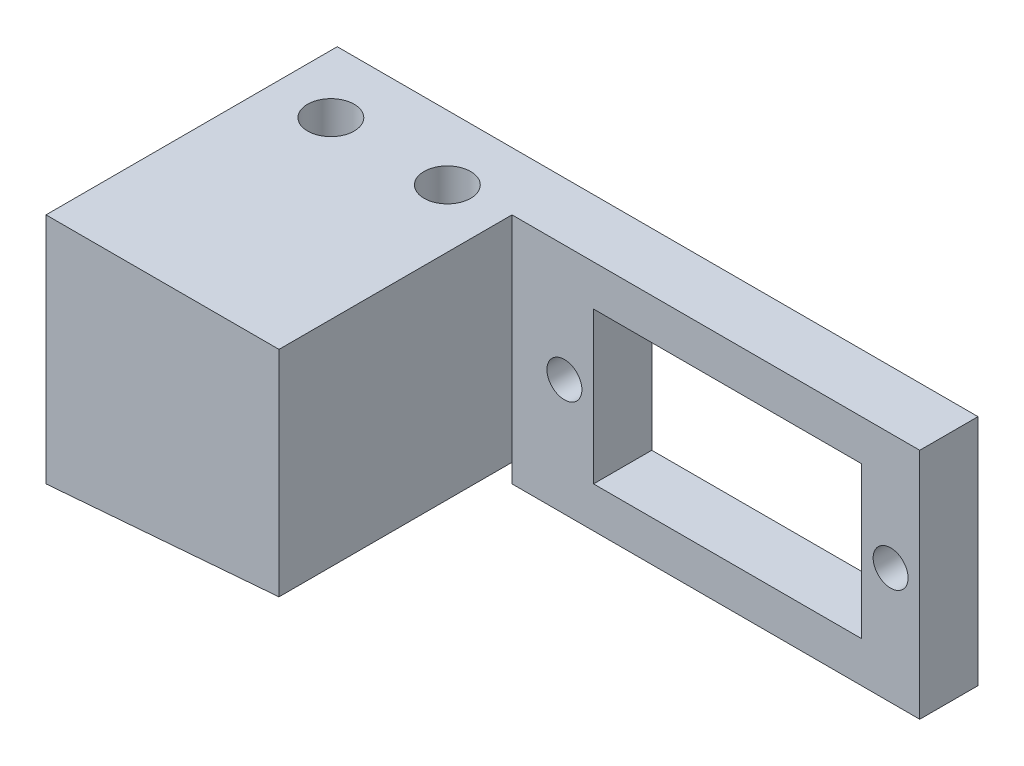
ISO-10303-21;
HEADER;
FILE_DESCRIPTION(('STEP AP214'),'2;1');
FILE_NAME('part.step','',(''),(''),'','','');
FILE_SCHEMA(('AUTOMOTIVE_DESIGN { 1 0 10303 214 1 1 1 1 }'));
ENDSEC;
DATA;
#1=APPLICATION_CONTEXT('core data for automotive mechanical design processes');
#2=APPLICATION_PROTOCOL_DEFINITION('international standard','automotive_design',2000,#1);
#3=PRODUCT_CONTEXT('',#1,'mechanical');
#4=PRODUCT('Part','Part','',(#3));
#5=PRODUCT_RELATED_PRODUCT_CATEGORY('part','',(#4));
#6=PRODUCT_DEFINITION_FORMATION('','',#4);
#7=PRODUCT_DEFINITION_CONTEXT('part definition',#1,'design');
#8=PRODUCT_DEFINITION('design','',#6,#7);
#9=PRODUCT_DEFINITION_SHAPE('','',#8);
#10=(LENGTH_UNIT() NAMED_UNIT(*) SI_UNIT(.MILLI.,.METRE.));
#11=(NAMED_UNIT(*) PLANE_ANGLE_UNIT() SI_UNIT($,.RADIAN.));
#12=(NAMED_UNIT(*) SI_UNIT($,.STERADIAN.) SOLID_ANGLE_UNIT());
#13=UNCERTAINTY_MEASURE_WITH_UNIT(LENGTH_MEASURE(1.E-05),#10,'distance_accuracy_value','');
#14=(GEOMETRIC_REPRESENTATION_CONTEXT(3) GLOBAL_UNCERTAINTY_ASSIGNED_CONTEXT((#13)) GLOBAL_UNIT_ASSIGNED_CONTEXT((#10,
#11,#12)) REPRESENTATION_CONTEXT('',''));
#15=CARTESIAN_POINT('',(0.,0.,0.));
#16=DIRECTION('',(0.,0.,1.));
#17=DIRECTION('',(1.,0.,0.));
#18=AXIS2_PLACEMENT_3D('',#15,#16,#17);
#19=CARTESIAN_POINT('',(0.,0.,5.));
#20=DIRECTION('',(0.,0.,1.));
#21=DIRECTION('',(1.,0.,0.));
#22=AXIS2_PLACEMENT_3D('',#19,#20,#21);
#23=PLANE('',#22);
#24=DIRECTION('',(0.,1.,0.));
#25=VECTOR('',#24,1.);
#26=CARTESIAN_POINT('',(-8.33333333333336,-10.0666666666667,5.));
#27=LINE('',#26,#25);
#28=CARTESIAN_POINT('',(-8.33333333333336,-11.6666666666667,5.));
#29=VERTEX_POINT('',#28);
#30=CARTESIAN_POINT('',(-8.33333333333336,-10.0666666666667,5.));
#31=VERTEX_POINT('',#30);
#32=EDGE_CURVE('E128',#29,#31,#27,.T.);
#33=ORIENTED_EDGE('',*,*,#32,.F.);
#34=DIRECTION('',(1.,0.,0.));
#35=VECTOR('',#34,1.);
#36=CARTESIAN_POINT('',(-28.3333333333334,-11.6666666666667,5.));
#37=LINE('',#36,#35);
#38=CARTESIAN_POINT('',(26.6666666666666,-11.6666666666667,5.));
#39=VERTEX_POINT('',#38);
#40=EDGE_CURVE('E135',#29,#39,#37,.T.);
#41=ORIENTED_EDGE('',*,*,#40,.T.);
#42=DIRECTION('',(0.,1.,0.));
#43=VECTOR('',#42,1.);
#44=CARTESIAN_POINT('',(26.6666666666666,8.33333333333334,5.));
#45=LINE('',#44,#43);
#46=CARTESIAN_POINT('',(26.6666666666666,8.33333333333334,5.));
#47=VERTEX_POINT('',#46);
#48=EDGE_CURVE('E144',#39,#47,#45,.T.);
#49=ORIENTED_EDGE('',*,*,#48,.T.);
#50=DIRECTION('',(-1.,0.,0.));
#51=VECTOR('',#50,1.);
#52=CARTESIAN_POINT('',(-28.3333333333334,8.33333333333334,5.));
#53=LINE('',#52,#51);
#54=CARTESIAN_POINT('',(-8.33333333333336,8.33333333333334,5.));
#55=VERTEX_POINT('',#54);
#56=EDGE_CURVE('E51',#47,#55,#53,.T.);
#57=ORIENTED_EDGE('',*,*,#56,.T.);
#58=DIRECTION('',(0.,1.,0.));
#59=VECTOR('',#58,1.);
#60=CARTESIAN_POINT('',(-8.33333333333336,0.,5.));
#61=LINE('',#60,#59);
#62=EDGE_CURVE('E137',#31,#55,#61,.T.);
#63=ORIENTED_EDGE('',*,*,#62,.F.);
#64=EDGE_LOOP('',(#33,#41,#49,#57,#63));
#65=FACE_BOUND('',#64,.T.);
#66=CARTESIAN_POINT('',(-3.83333333333336,-1.66666666666666,5.));
#67=DIRECTION('',(0.,0.,1.));
#68=DIRECTION('',(1.,0.,0.));
#69=AXIS2_PLACEMENT_3D('',#66,#67,#68);
#70=CIRCLE('',#69,1.5);
#71=CARTESIAN_POINT('',(-2.33333333333336,-1.66666666666666,5.));
#72=VERTEX_POINT('',#71);
#73=EDGE_CURVE('E234',#72,#72,#70,.T.);
#74=ORIENTED_EDGE('',*,*,#73,.F.);
#75=EDGE_LOOP('',(#74));
#76=FACE_BOUND('',#75,.T.);
#77=CARTESIAN_POINT('',(24.1666666666666,-1.66666666666666,5.));
#78=DIRECTION('',(0.,0.,1.));
#79=DIRECTION('',(1.,0.,0.));
#80=AXIS2_PLACEMENT_3D('',#77,#78,#79);
#81=CIRCLE('',#80,1.5);
#82=CARTESIAN_POINT('',(25.6666666666666,-1.66666666666666,5.));
#83=VERTEX_POINT('',#82);
#84=EDGE_CURVE('E235',#83,#83,#81,.T.);
#85=ORIENTED_EDGE('',*,*,#84,.F.);
#86=EDGE_LOOP('',(#85));
#87=FACE_BOUND('',#86,.T.);
#88=DIRECTION('',(0.,1.,0.));
#89=VECTOR('',#88,1.);
#90=CARTESIAN_POINT('',(21.6666666666666,4.83333333333334,5.));
#91=LINE('',#90,#89);
#92=CARTESIAN_POINT('',(21.6666666666666,-8.16666666666666,5.));
#93=VERTEX_POINT('',#92);
#94=CARTESIAN_POINT('',(21.6666666666666,4.83333333333334,5.));
#95=VERTEX_POINT('',#94);
#96=EDGE_CURVE('E59',#93,#95,#91,.T.);
#97=ORIENTED_EDGE('',*,*,#96,.F.);
#98=DIRECTION('',(1.,0.,0.));
#99=VECTOR('',#98,1.);
#100=CARTESIAN_POINT('',(21.6666666666666,-8.16666666666666,5.));
#101=LINE('',#100,#99);
#102=CARTESIAN_POINT('',(-1.33333333333336,-8.16666666666666,5.));
#103=VERTEX_POINT('',#102);
#104=EDGE_CURVE('E247',#103,#93,#101,.T.);
#105=ORIENTED_EDGE('',*,*,#104,.F.);
#106=DIRECTION('',(0.,-1.,0.));
#107=VECTOR('',#106,1.);
#108=CARTESIAN_POINT('',(-1.33333333333336,4.83333333333334,5.));
#109=LINE('',#108,#107);
#110=CARTESIAN_POINT('',(-1.33333333333336,4.83333333333334,5.));
#111=VERTEX_POINT('',#110);
#112=EDGE_CURVE('E244',#111,#103,#109,.T.);
#113=ORIENTED_EDGE('',*,*,#112,.F.);
#114=DIRECTION('',(-1.,0.,0.));
#115=VECTOR('',#114,1.);
#116=CARTESIAN_POINT('',(21.6666666666666,4.83333333333334,5.));
#117=LINE('',#116,#115);
#118=EDGE_CURVE('E241',#95,#111,#117,.T.);
#119=ORIENTED_EDGE('',*,*,#118,.F.);
#120=EDGE_LOOP('',(#97,#105,#113,#119));
#121=FACE_BOUND('',#120,.T.);
#122=ADVANCED_FACE('F36',(#65,#76,#87,#121),#23,.T.);
#123=CARTESIAN_POINT('',(-28.3333333333334,8.33333333333334,5.));
#124=DIRECTION('',(1.,0.,0.));
#125=DIRECTION('',(0.,0.,-1.));
#126=AXIS2_PLACEMENT_3D('',#123,#124,#125);
#127=PLANE('',#126);
#128=DIRECTION('',(0.,-1.,0.));
#129=VECTOR('',#128,1.);
#130=CARTESIAN_POINT('',(-28.3333333333334,8.33333333333334,0.));
#131=LINE('',#130,#129);
#132=CARTESIAN_POINT('',(-28.3333333333334,8.33333333333334,0.));
#133=VERTEX_POINT('',#132);
#134=CARTESIAN_POINT('',(-28.3333333333334,-11.6666666666667,0.));
#135=VERTEX_POINT('',#134);
#136=EDGE_CURVE('E156',#133,#135,#131,.T.);
#137=ORIENTED_EDGE('',*,*,#136,.T.);
#138=DIRECTION('',(0.,0.,-1.));
#139=VECTOR('',#138,1.);
#140=CARTESIAN_POINT('',(-28.3333333333334,-11.6666666666667,5.));
#141=LINE('',#140,#139);
#142=CARTESIAN_POINT('',(-28.3333333333334,-11.6666666666667,25.));
#143=VERTEX_POINT('',#142);
#144=EDGE_CURVE('E169',#143,#135,#141,.T.);
#145=ORIENTED_EDGE('',*,*,#144,.F.);
#146=DIRECTION('',(0.,1.,0.));
#147=VECTOR('',#146,1.);
#148=CARTESIAN_POINT('',(-28.3333333333334,-11.6666666666667,25.));
#149=LINE('',#148,#147);
#150=CARTESIAN_POINT('',(-28.3333333333334,8.33333333333334,25.));
#151=VERTEX_POINT('',#150);
#152=EDGE_CURVE('E214',#143,#151,#149,.T.);
#153=ORIENTED_EDGE('',*,*,#152,.T.);
#154=DIRECTION('',(0.,0.,-1.));
#155=VECTOR('',#154,1.);
#156=CARTESIAN_POINT('',(-28.3333333333334,8.33333333333334,5.));
#157=LINE('',#156,#155);
#158=EDGE_CURVE('E155',#151,#133,#157,.T.);
#159=ORIENTED_EDGE('',*,*,#158,.T.);
#160=EDGE_LOOP('',(#137,#145,#153,#159));
#161=FACE_BOUND('',#160,.T.);
#162=ADVANCED_FACE('F38',(#161),#127,.F.);
#163=CARTESIAN_POINT('',(-28.3333333333334,-11.6666666666667,5.));
#164=DIRECTION('',(0.,1.,0.));
#165=DIRECTION('',(0.,0.,1.));
#166=AXIS2_PLACEMENT_3D('',#163,#164,#165);
#167=PLANE('',#166);
#168=ORIENTED_EDGE('',*,*,#40,.F.);
#169=DIRECTION('',(0.,0.,1.));
#170=VECTOR('',#169,1.);
#171=CARTESIAN_POINT('',(-8.33333333333336,-11.6666666666667,-10.));
#172=LINE('',#171,#170);
#173=CARTESIAN_POINT('',(-8.33333333333336,-11.6666666666667,0.));
#174=VERTEX_POINT('',#173);
#175=EDGE_CURVE('E124',#174,#29,#172,.T.);
#176=ORIENTED_EDGE('',*,*,#175,.F.);
#177=DIRECTION('',(1.,0.,0.));
#178=VECTOR('',#177,1.);
#179=CARTESIAN_POINT('',(-28.3333333333334,-11.6666666666667,0.));
#180=LINE('',#179,#178);
#181=CARTESIAN_POINT('',(26.6666666666666,-11.6666666666667,0.));
#182=VERTEX_POINT('',#181);
#183=EDGE_CURVE('E159',#174,#182,#180,.T.);
#184=ORIENTED_EDGE('',*,*,#183,.T.);
#185=DIRECTION('',(0.,0.,-1.));
#186=VECTOR('',#185,1.);
#187=CARTESIAN_POINT('',(26.6666666666666,-11.6666666666667,5.));
#188=LINE('',#187,#186);
#189=EDGE_CURVE('E142',#39,#182,#188,.T.);
#190=ORIENTED_EDGE('',*,*,#189,.F.);
#191=EDGE_LOOP('',(#168,#176,#184,#190));
#192=FACE_BOUND('',#191,.T.);
#193=ADVANCED_FACE('F140',(#192),#167,.F.);
#194=CARTESIAN_POINT('',(26.6666666666666,8.33333333333334,5.));
#195=DIRECTION('',(-1.,0.,0.));
#196=DIRECTION('',(0.,0.,1.));
#197=AXIS2_PLACEMENT_3D('',#194,#195,#196);
#198=PLANE('',#197);
#199=DIRECTION('',(0.,1.,0.));
#200=VECTOR('',#199,1.);
#201=CARTESIAN_POINT('',(26.6666666666666,8.33333333333334,0.));
#202=LINE('',#201,#200);
#203=CARTESIAN_POINT('',(26.6666666666666,8.33333333333334,0.));
#204=VERTEX_POINT('',#203);
#205=EDGE_CURVE('E148',#182,#204,#202,.T.);
#206=ORIENTED_EDGE('',*,*,#205,.T.);
#207=DIRECTION('',(0.,0.,-1.));
#208=VECTOR('',#207,1.);
#209=CARTESIAN_POINT('',(26.6666666666666,8.33333333333334,5.));
#210=LINE('',#209,#208);
#211=EDGE_CURVE('E165',#47,#204,#210,.T.);
#212=ORIENTED_EDGE('',*,*,#211,.F.);
#213=ORIENTED_EDGE('',*,*,#48,.F.);
#214=ORIENTED_EDGE('',*,*,#189,.T.);
#215=EDGE_LOOP('',(#206,#212,#213,#214));
#216=FACE_BOUND('',#215,.T.);
#217=ADVANCED_FACE('F293',(#216),#198,.F.);
#218=CARTESIAN_POINT('',(-28.3333333333334,8.33333333333334,5.));
#219=DIRECTION('',(0.,-1.,0.));
#220=DIRECTION('',(0.,0.,-1.));
#221=AXIS2_PLACEMENT_3D('',#218,#219,#220);
#222=PLANE('',#221);
#223=CARTESIAN_POINT('',(-23.3333333333334,8.33333333333334,5.54812466747023));
#224=DIRECTION('',(0.,1.,0.));
#225=DIRECTION('',(0.,0.,1.));
#226=AXIS2_PLACEMENT_3D('',#223,#224,#225);
#227=CIRCLE('',#226,2.);
#228=CARTESIAN_POINT('',(-23.3333333333334,8.33333333333334,7.54812466747024));
#229=VERTEX_POINT('',#228);
#230=EDGE_CURVE('E215',#229,#229,#227,.T.);
#231=ORIENTED_EDGE('',*,*,#230,.F.);
#232=EDGE_LOOP('',(#231));
#233=FACE_BOUND('',#232,.T.);
#234=CARTESIAN_POINT('',(-13.3333333333334,8.33333333333334,5.54812466747023));
#235=DIRECTION('',(0.,1.,0.));
#236=DIRECTION('',(0.,0.,1.));
#237=AXIS2_PLACEMENT_3D('',#234,#235,#236);
#238=CIRCLE('',#237,2.);
#239=CARTESIAN_POINT('',(-13.3333333333334,8.33333333333334,7.54812466747023));
#240=VERTEX_POINT('',#239);
#241=EDGE_CURVE('E221',#240,#240,#238,.T.);
#242=ORIENTED_EDGE('',*,*,#241,.F.);
#243=EDGE_LOOP('',(#242));
#244=FACE_BOUND('',#243,.T.);
#245=DIRECTION('',(-1.,0.,0.));
#246=VECTOR('',#245,1.);
#247=CARTESIAN_POINT('',(-28.3333333333334,8.33333333333334,0.));
#248=LINE('',#247,#246);
#249=EDGE_CURVE('E145',#204,#133,#248,.T.);
#250=ORIENTED_EDGE('',*,*,#249,.T.);
#251=ORIENTED_EDGE('',*,*,#158,.F.);
#252=DIRECTION('',(1.,0.,0.));
#253=VECTOR('',#252,1.);
#254=CARTESIAN_POINT('',(-28.3333333333334,8.33333333333334,25.));
#255=LINE('',#254,#253);
#256=CARTESIAN_POINT('',(-8.33333333333336,8.33333333333334,25.));
#257=VERTEX_POINT('',#256);
#258=EDGE_CURVE('E218',#151,#257,#255,.T.);
#259=ORIENTED_EDGE('',*,*,#258,.T.);
#260=DIRECTION('',(0.,0.,-1.));
#261=VECTOR('',#260,1.);
#262=CARTESIAN_POINT('',(-8.33333333333336,8.33333333333334,25.));
#263=LINE('',#262,#261);
#264=EDGE_CURVE('E229',#257,#55,#263,.T.);
#265=ORIENTED_EDGE('',*,*,#264,.T.);
#266=ORIENTED_EDGE('',*,*,#56,.F.);
#267=ORIENTED_EDGE('',*,*,#211,.T.);
#268=EDGE_LOOP('',(#250,#251,#259,#265,#266,#267));
#269=FACE_BOUND('',#268,.T.);
#270=ADVANCED_FACE('F289',(#233,#244,#269),#222,.F.);
#271=CARTESIAN_POINT('',(0.,0.,0.));
#272=DIRECTION('',(0.,0.,1.));
#273=DIRECTION('',(1.,0.,0.));
#274=AXIS2_PLACEMENT_3D('',#271,#272,#273);
#275=PLANE('',#274);
#276=CARTESIAN_POINT('',(-3.83333333333336,-1.66666666666666,0.));
#277=DIRECTION('',(0.,0.,1.));
#278=DIRECTION('',(1.,0.,0.));
#279=AXIS2_PLACEMENT_3D('',#276,#277,#278);
#280=CIRCLE('',#279,1.5);
#281=CARTESIAN_POINT('',(-2.33333333333336,-1.66666666666666,0.));
#282=VERTEX_POINT('',#281);
#283=EDGE_CURVE('E160',#282,#282,#280,.T.);
#284=ORIENTED_EDGE('',*,*,#283,.T.);
#285=EDGE_LOOP('',(#284));
#286=FACE_BOUND('',#285,.T.);
#287=CARTESIAN_POINT('',(24.1666666666666,-1.66666666666666,0.));
#288=DIRECTION('',(0.,0.,1.));
#289=DIRECTION('',(1.,0.,0.));
#290=AXIS2_PLACEMENT_3D('',#287,#288,#289);
#291=CIRCLE('',#290,1.5);
#292=CARTESIAN_POINT('',(25.6666666666666,-1.66666666666666,0.));
#293=VERTEX_POINT('',#292);
#294=EDGE_CURVE('E184',#293,#293,#291,.T.);
#295=ORIENTED_EDGE('',*,*,#294,.T.);
#296=EDGE_LOOP('',(#295));
#297=FACE_BOUND('',#296,.T.);
#298=DIRECTION('',(1.,0.,0.));
#299=VECTOR('',#298,1.);
#300=CARTESIAN_POINT('',(0.,-8.16666666666666,0.));
#301=LINE('',#300,#299);
#302=CARTESIAN_POINT('',(-1.33333333333336,-8.16666666666666,0.));
#303=VERTEX_POINT('',#302);
#304=CARTESIAN_POINT('',(21.6666666666666,-8.16666666666666,0.));
#305=VERTEX_POINT('',#304);
#306=EDGE_CURVE('E177',#303,#305,#301,.T.);
#307=ORIENTED_EDGE('',*,*,#306,.T.);
#308=DIRECTION('',(0.,1.,0.));
#309=VECTOR('',#308,1.);
#310=CARTESIAN_POINT('',(21.6666666666666,0.,0.));
#311=LINE('',#310,#309);
#312=CARTESIAN_POINT('',(21.6666666666666,4.83333333333334,0.));
#313=VERTEX_POINT('',#312);
#314=EDGE_CURVE('E180',#305,#313,#311,.T.);
#315=ORIENTED_EDGE('',*,*,#314,.T.);
#316=DIRECTION('',(-1.,0.,0.));
#317=VECTOR('',#316,1.);
#318=CARTESIAN_POINT('',(0.,4.83333333333334,0.));
#319=LINE('',#318,#317);
#320=CARTESIAN_POINT('',(-1.33333333333336,4.83333333333334,0.));
#321=VERTEX_POINT('',#320);
#322=EDGE_CURVE('E171',#313,#321,#319,.T.);
#323=ORIENTED_EDGE('',*,*,#322,.T.);
#324=DIRECTION('',(0.,-1.,0.));
#325=VECTOR('',#324,1.);
#326=CARTESIAN_POINT('',(-1.33333333333336,0.,0.));
#327=LINE('',#326,#325);
#328=EDGE_CURVE('E174',#321,#303,#327,.T.);
#329=ORIENTED_EDGE('',*,*,#328,.T.);
#330=EDGE_LOOP('',(#307,#315,#323,#329));
#331=FACE_BOUND('',#330,.T.);
#332=DIRECTION('',(0.,1.,0.));
#333=VECTOR('',#332,1.);
#334=CARTESIAN_POINT('',(-8.33333333333336,0.,0.));
#335=LINE('',#334,#333);
#336=CARTESIAN_POINT('',(-8.33333333333336,-10.0666666666667,0.));
#337=VERTEX_POINT('',#336);
#338=EDGE_CURVE('E11',#174,#337,#335,.T.);
#339=ORIENTED_EDGE('',*,*,#338,.T.);
#340=DIRECTION('',(-0.996815278536125,-0.07974522228289,0.));
#341=VECTOR('',#340,1.);
#342=CARTESIAN_POINT('',(0.747217806041335,-9.34022257551669,0.));
#343=LINE('',#342,#341);
#344=EDGE_CURVE('E437',#337,#135,#343,.T.);
#345=ORIENTED_EDGE('',*,*,#344,.T.);
#346=ORIENTED_EDGE('',*,*,#136,.F.);
#347=ORIENTED_EDGE('',*,*,#249,.F.);
#348=ORIENTED_EDGE('',*,*,#205,.F.);
#349=ORIENTED_EDGE('',*,*,#183,.F.);
#350=EDGE_LOOP('',(#339,#345,#346,#347,#348,#349));
#351=FACE_BOUND('',#350,.T.);
#352=ADVANCED_FACE('F265',(#286,#297,#331,#351),#275,.F.);
#353=CARTESIAN_POINT('',(21.6666666666666,4.83333333333334,-15.));
#354=DIRECTION('',(1.,0.,0.));
#355=DIRECTION('',(0.,0.,-1.));
#356=AXIS2_PLACEMENT_3D('',#353,#354,#355);
#357=PLANE('',#356);
#358=DIRECTION('',(0.,0.,1.));
#359=VECTOR('',#358,1.);
#360=CARTESIAN_POINT('',(21.6666666666666,-8.16666666666666,-15.));
#361=LINE('',#360,#359);
#362=EDGE_CURVE('E187',#305,#93,#361,.T.);
#363=ORIENTED_EDGE('',*,*,#362,.T.);
#364=ORIENTED_EDGE('',*,*,#96,.T.);
#365=DIRECTION('',(0.,0.,1.));
#366=VECTOR('',#365,1.);
#367=CARTESIAN_POINT('',(21.6666666666666,4.83333333333334,-15.));
#368=LINE('',#367,#366);
#369=EDGE_CURVE('E151',#313,#95,#368,.T.);
#370=ORIENTED_EDGE('',*,*,#369,.F.);
#371=ORIENTED_EDGE('',*,*,#314,.F.);
#372=EDGE_LOOP('',(#363,#364,#370,#371));
#373=FACE_BOUND('',#372,.T.);
#374=ADVANCED_FACE('F268',(#373),#357,.F.);
#375=CARTESIAN_POINT('',(21.6666666666666,-8.16666666666666,-15.));
#376=DIRECTION('',(0.,-1.,0.));
#377=DIRECTION('',(1.,0.,0.));
#378=AXIS2_PLACEMENT_3D('',#375,#376,#377);
#379=PLANE('',#378);
#380=DIRECTION('',(0.,0.,1.));
#381=VECTOR('',#380,1.);
#382=CARTESIAN_POINT('',(-1.33333333333336,-8.16666666666666,-15.));
#383=LINE('',#382,#381);
#384=EDGE_CURVE('E251',#303,#103,#383,.T.);
#385=ORIENTED_EDGE('',*,*,#384,.T.);
#386=ORIENTED_EDGE('',*,*,#104,.T.);
#387=ORIENTED_EDGE('',*,*,#362,.F.);
#388=ORIENTED_EDGE('',*,*,#306,.F.);
#389=EDGE_LOOP('',(#385,#386,#387,#388));
#390=FACE_BOUND('',#389,.T.);
#391=ADVANCED_FACE('F269',(#390),#379,.F.);
#392=CARTESIAN_POINT('',(-1.33333333333336,4.83333333333334,-15.));
#393=DIRECTION('',(-1.,0.,0.));
#394=DIRECTION('',(0.,-1.,0.));
#395=AXIS2_PLACEMENT_3D('',#392,#393,#394);
#396=PLANE('',#395);
#397=DIRECTION('',(0.,0.,1.));
#398=VECTOR('',#397,1.);
#399=CARTESIAN_POINT('',(-1.33333333333336,4.83333333333334,-15.));
#400=LINE('',#399,#398);
#401=EDGE_CURVE('E252',#321,#111,#400,.T.);
#402=ORIENTED_EDGE('',*,*,#401,.T.);
#403=ORIENTED_EDGE('',*,*,#112,.T.);
#404=ORIENTED_EDGE('',*,*,#384,.F.);
#405=ORIENTED_EDGE('',*,*,#328,.F.);
#406=EDGE_LOOP('',(#402,#403,#404,#405));
#407=FACE_BOUND('',#406,.T.);
#408=ADVANCED_FACE('F262',(#407),#396,.F.);
#409=CARTESIAN_POINT('',(21.6666666666666,4.83333333333334,-15.));
#410=DIRECTION('',(0.,1.,0.));
#411=DIRECTION('',(-1.,0.,0.));
#412=AXIS2_PLACEMENT_3D('',#409,#410,#411);
#413=PLANE('',#412);
#414=ORIENTED_EDGE('',*,*,#369,.T.);
#415=ORIENTED_EDGE('',*,*,#118,.T.);
#416=ORIENTED_EDGE('',*,*,#401,.F.);
#417=ORIENTED_EDGE('',*,*,#322,.F.);
#418=EDGE_LOOP('',(#414,#415,#416,#417));
#419=FACE_BOUND('',#418,.T.);
#420=ADVANCED_FACE('F257',(#419),#413,.F.);
#421=CARTESIAN_POINT('',(24.1666666666666,-1.66666666666666,-15.));
#422=DIRECTION('',(0.,0.,1.));
#423=DIRECTION('',(1.,0.,0.));
#424=AXIS2_PLACEMENT_3D('',#421,#422,#423);
#425=CYLINDRICAL_SURFACE('',#424,1.5);
#426=ORIENTED_EDGE('',*,*,#84,.T.);
#427=EDGE_LOOP('',(#426));
#428=FACE_BOUND('',#427,.T.);
#429=ORIENTED_EDGE('',*,*,#294,.F.);
#430=EDGE_LOOP('',(#429));
#431=FACE_BOUND('',#430,.T.);
#432=ADVANCED_FACE('F339',(#428,#431),#425,.F.);
#433=CARTESIAN_POINT('',(-3.83333333333336,-1.66666666666666,-15.));
#434=DIRECTION('',(0.,0.,1.));
#435=DIRECTION('',(1.,0.,0.));
#436=AXIS2_PLACEMENT_3D('',#433,#434,#435);
#437=CYLINDRICAL_SURFACE('',#436,1.5);
#438=ORIENTED_EDGE('',*,*,#73,.T.);
#439=EDGE_LOOP('',(#438));
#440=FACE_BOUND('',#439,.T.);
#441=ORIENTED_EDGE('',*,*,#283,.F.);
#442=EDGE_LOOP('',(#441));
#443=FACE_BOUND('',#442,.T.);
#444=ADVANCED_FACE('F201',(#440,#443),#437,.F.);
#445=CARTESIAN_POINT('',(-8.33333333333336,-10.0666666666667,25.));
#446=DIRECTION('',(0.07974522228289,-0.996815278536125,0.));
#447=DIRECTION('',(0.996815278536125,0.07974522228289,0.));
#448=AXIS2_PLACEMENT_3D('',#445,#446,#447);
#449=PLANE('',#448);
#450=CARTESIAN_POINT('',(-23.3333333333334,-11.2666666666667,5.54812466747023));
#451=DIRECTION('',(0.07974522228289,-0.996815278536125,0.));
#452=DIRECTION('',(0.996815278536125,0.07974522228289,0.));
#453=AXIS2_PLACEMENT_3D('',#450,#451,#452);
#454=ELLIPSE('',#453,2.00638979263752,2.);
#455=CARTESIAN_POINT('',(-21.3333333333334,-11.1066666666667,5.54812466747023));
#456=VERTEX_POINT('',#455);
#457=EDGE_CURVE('E44',#456,#456,#454,.T.);
#458=ORIENTED_EDGE('',*,*,#457,.F.);
#459=EDGE_LOOP('',(#458));
#460=FACE_BOUND('',#459,.T.);
#461=CARTESIAN_POINT('',(-13.3333333333334,-10.4666666666667,5.54812466747023));
#462=DIRECTION('',(0.07974522228289,-0.996815278536125,0.));
#463=DIRECTION('',(0.996815278536125,0.07974522228289,0.));
#464=AXIS2_PLACEMENT_3D('',#461,#462,#463);
#465=ELLIPSE('',#464,2.00638979263751,2.);
#466=CARTESIAN_POINT('',(-11.3333333333334,-10.3066666666667,5.54812466747023));
#467=VERTEX_POINT('',#466);
#468=EDGE_CURVE('E183',#467,#467,#465,.T.);
#469=ORIENTED_EDGE('',*,*,#468,.F.);
#470=EDGE_LOOP('',(#469));
#471=FACE_BOUND('',#470,.T.);
#472=DIRECTION('',(-0.996815278536125,-0.07974522228289,0.));
#473=VECTOR('',#472,1.);
#474=CARTESIAN_POINT('',(-8.33333333333336,-10.0666666666667,25.));
#475=LINE('',#474,#473);
#476=CARTESIAN_POINT('',(-8.33333333333336,-10.0666666666667,25.));
#477=VERTEX_POINT('',#476);
#478=EDGE_CURVE('E207',#477,#143,#475,.T.);
#479=ORIENTED_EDGE('',*,*,#478,.T.);
#480=ORIENTED_EDGE('',*,*,#144,.T.);
#481=ORIENTED_EDGE('',*,*,#344,.F.);
#482=DIRECTION('',(0.,0.,1.));
#483=VECTOR('',#482,1.);
#484=CARTESIAN_POINT('',(-8.33333333333336,-10.0666666666667,-10.));
#485=LINE('',#484,#483);
#486=EDGE_CURVE('E132',#337,#31,#485,.T.);
#487=ORIENTED_EDGE('',*,*,#486,.T.);
#488=DIRECTION('',(0.,0.,-1.));
#489=VECTOR('',#488,1.);
#490=CARTESIAN_POINT('',(-8.33333333333336,-10.0666666666667,25.));
#491=LINE('',#490,#489);
#492=EDGE_CURVE('E209',#477,#31,#491,.T.);
#493=ORIENTED_EDGE('',*,*,#492,.F.);
#494=EDGE_LOOP('',(#479,#480,#481,#487,#493));
#495=FACE_BOUND('',#494,.T.);
#496=ADVANCED_FACE('F197',(#460,#471,#495),#449,.T.);
#497=CARTESIAN_POINT('',(-8.33333333333336,8.33333333333334,25.));
#498=DIRECTION('',(1.,0.,0.));
#499=DIRECTION('',(0.,1.,0.));
#500=AXIS2_PLACEMENT_3D('',#497,#498,#499);
#501=PLANE('',#500);
#502=ORIENTED_EDGE('',*,*,#492,.T.);
#503=ORIENTED_EDGE('',*,*,#62,.T.);
#504=ORIENTED_EDGE('',*,*,#264,.F.);
#505=DIRECTION('',(0.,-1.,0.));
#506=VECTOR('',#505,1.);
#507=CARTESIAN_POINT('',(-8.33333333333336,8.33333333333334,25.));
#508=LINE('',#507,#506);
#509=EDGE_CURVE('E227',#257,#477,#508,.T.);
#510=ORIENTED_EDGE('',*,*,#509,.T.);
#511=EDGE_LOOP('',(#502,#503,#504,#510));
#512=FACE_BOUND('',#511,.T.);
#513=ADVANCED_FACE('F200',(#512),#501,.T.);
#514=CARTESIAN_POINT('',(0.,0.,25.));
#515=DIRECTION('',(0.,0.,-1.));
#516=DIRECTION('',(-1.,0.,0.));
#517=AXIS2_PLACEMENT_3D('',#514,#515,#516);
#518=PLANE('',#517);
#519=ORIENTED_EDGE('',*,*,#478,.F.);
#520=ORIENTED_EDGE('',*,*,#509,.F.);
#521=ORIENTED_EDGE('',*,*,#258,.F.);
#522=ORIENTED_EDGE('',*,*,#152,.F.);
#523=EDGE_LOOP('',(#519,#520,#521,#522));
#524=FACE_BOUND('',#523,.T.);
#525=ADVANCED_FACE('F360',(#524),#518,.F.);
#526=CARTESIAN_POINT('',(-13.3333333333334,-11.6666666666667,5.54812466747023));
#527=DIRECTION('',(0.,1.,0.));
#528=DIRECTION('',(0.,0.,1.));
#529=AXIS2_PLACEMENT_3D('',#526,#527,#528);
#530=CYLINDRICAL_SURFACE('',#529,2.);
#531=ORIENTED_EDGE('',*,*,#468,.T.);
#532=EDGE_LOOP('',(#531));
#533=FACE_BOUND('',#532,.T.);
#534=ORIENTED_EDGE('',*,*,#241,.T.);
#535=EDGE_LOOP('',(#534));
#536=FACE_BOUND('',#535,.T.);
#537=ADVANCED_FACE('F364',(#533,#536),#530,.F.);
#538=CARTESIAN_POINT('',(-23.3333333333334,-11.6666666666667,5.54812466747023));
#539=DIRECTION('',(0.,1.,0.));
#540=DIRECTION('',(0.,0.,1.));
#541=AXIS2_PLACEMENT_3D('',#538,#539,#540);
#542=CYLINDRICAL_SURFACE('',#541,2.);
#543=ORIENTED_EDGE('',*,*,#457,.T.);
#544=EDGE_LOOP('',(#543));
#545=FACE_BOUND('',#544,.T.);
#546=ORIENTED_EDGE('',*,*,#230,.T.);
#547=EDGE_LOOP('',(#546));
#548=FACE_BOUND('',#547,.T.);
#549=ADVANCED_FACE('F194',(#545,#548),#542,.F.);
#550=CARTESIAN_POINT('',(-8.33333333333336,-10.0666666666667,-10.));
#551=DIRECTION('',(1.,0.,0.));
#552=DIRECTION('',(0.,0.,-1.));
#553=AXIS2_PLACEMENT_3D('',#550,#551,#552);
#554=PLANE('',#553);
#555=ORIENTED_EDGE('',*,*,#175,.T.);
#556=ORIENTED_EDGE('',*,*,#32,.T.);
#557=ORIENTED_EDGE('',*,*,#486,.F.);
#558=ORIENTED_EDGE('',*,*,#338,.F.);
#559=EDGE_LOOP('',(#555,#556,#557,#558));
#560=FACE_BOUND('',#559,.T.);
#561=ADVANCED_FACE('F126',(#560),#554,.F.);
#562=CLOSED_SHELL('',(#122,#162,#193,#217,#270,#352,#374,#391,#408,#420,#432,#444,#496,#513,
#525,#537,#549,#561));
#563=MANIFOLD_SOLID_BREP('B2',#562);
#564=ADVANCED_BREP_SHAPE_REPRESENTATION('',(#18,#563),#14);
#565=SHAPE_DEFINITION_REPRESENTATION(#9,#564);
ENDSEC;
END-ISO-10303-21;
